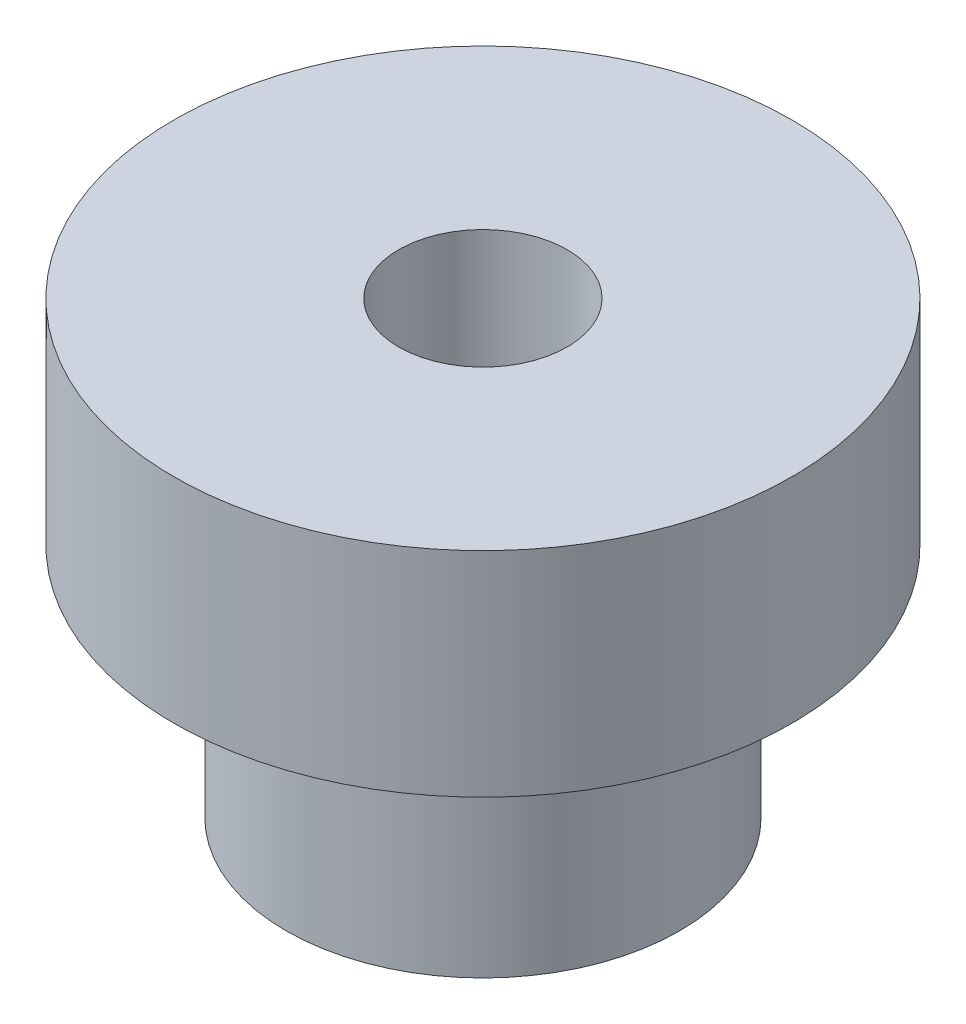
ISO-10303-21;
HEADER;
FILE_DESCRIPTION(('STEP AP214'),'2;1');
FILE_NAME('part.step','',(''),(''),'','','');
FILE_SCHEMA(('AUTOMOTIVE_DESIGN { 1 0 10303 214 1 1 1 1 }'));
ENDSEC;
DATA;
#1=APPLICATION_CONTEXT('core data for automotive mechanical design processes');
#2=APPLICATION_PROTOCOL_DEFINITION('international standard','automotive_design',2000,#1);
#3=PRODUCT_CONTEXT('',#1,'mechanical');
#4=PRODUCT('Part','Part','',(#3));
#5=PRODUCT_RELATED_PRODUCT_CATEGORY('part','',(#4));
#6=PRODUCT_DEFINITION_FORMATION('','',#4);
#7=PRODUCT_DEFINITION_CONTEXT('part definition',#1,'design');
#8=PRODUCT_DEFINITION('design','',#6,#7);
#9=PRODUCT_DEFINITION_SHAPE('','',#8);
#10=(LENGTH_UNIT() NAMED_UNIT(*) SI_UNIT(.MILLI.,.METRE.));
#11=(NAMED_UNIT(*) PLANE_ANGLE_UNIT() SI_UNIT($,.RADIAN.));
#12=(NAMED_UNIT(*) SI_UNIT($,.STERADIAN.) SOLID_ANGLE_UNIT());
#13=UNCERTAINTY_MEASURE_WITH_UNIT(LENGTH_MEASURE(1.E-05),#10,'distance_accuracy_value','');
#14=(GEOMETRIC_REPRESENTATION_CONTEXT(3) GLOBAL_UNCERTAINTY_ASSIGNED_CONTEXT((#13)) GLOBAL_UNIT_ASSIGNED_CONTEXT((#10,
#11,#12)) REPRESENTATION_CONTEXT('',''));
#15=CARTESIAN_POINT('',(0.,0.,0.));
#16=DIRECTION('',(0.,0.,1.));
#17=DIRECTION('',(1.,0.,0.));
#18=AXIS2_PLACEMENT_3D('',#15,#16,#17);
#19=CARTESIAN_POINT('',(0.,0.,0.));
#20=DIRECTION('',(0.,1.,0.));
#21=DIRECTION('',(0.,0.,1.));
#22=AXIS2_PLACEMENT_3D('',#19,#20,#21);
#23=PLANE('',#22);
#24=CARTESIAN_POINT('',(0.,0.,0.));
#25=DIRECTION('',(0.,1.,0.));
#26=DIRECTION('',(0.,0.,1.));
#27=AXIS2_PLACEMENT_3D('',#24,#25,#26);
#28=CIRCLE('',#27,5.5);
#29=CARTESIAN_POINT('',(0.,0.,-5.5));
#30=VERTEX_POINT('',#29);
#31=EDGE_CURVE('E42',#30,#30,#28,.T.);
#32=ORIENTED_EDGE('',*,*,#31,.F.);
#33=EDGE_LOOP('',(#32));
#34=FACE_BOUND('',#33,.T.);
#35=CARTESIAN_POINT('',(0.,0.,0.));
#36=DIRECTION('',(0.,1.,0.));
#37=DIRECTION('',(0.,0.,1.));
#38=AXIS2_PLACEMENT_3D('',#35,#36,#37);
#39=CIRCLE('',#38,3.5);
#40=CARTESIAN_POINT('',(0.,0.,3.5));
#41=VERTEX_POINT('',#40);
#42=EDGE_CURVE('E10',#41,#41,#39,.F.);
#43=ORIENTED_EDGE('',*,*,#42,.F.);
#44=EDGE_LOOP('',(#43));
#45=FACE_BOUND('',#44,.T.);
#46=ADVANCED_FACE('F31',(#34,#45),#23,.F.);
#47=CARTESIAN_POINT('',(0.,3.8,0.));
#48=DIRECTION('',(0.,-1.,0.));
#49=DIRECTION('',(0.,0.,-1.));
#50=AXIS2_PLACEMENT_3D('',#47,#48,#49);
#51=CYLINDRICAL_SURFACE('',#50,5.5);
#52=CARTESIAN_POINT('',(0.,3.8,0.));
#53=DIRECTION('',(0.,1.,0.));
#54=DIRECTION('',(0.,0.,1.));
#55=AXIS2_PLACEMENT_3D('',#52,#53,#54);
#56=CIRCLE('',#55,5.5);
#57=CARTESIAN_POINT('',(0.,3.8,-5.5));
#58=VERTEX_POINT('',#57);
#59=EDGE_CURVE('E38',#58,#58,#56,.T.);
#60=CARTESIAN_POINT('',(0.,3.8,-5.5));
#61=CARTESIAN_POINT('',(0.,3.76041666666667,-5.5));
#62=CARTESIAN_POINT('',(0.,3.72083333333333,-5.5));
#63=CARTESIAN_POINT('',(0.,3.64166666666667,-5.5));
#64=CARTESIAN_POINT('',(0.,3.60208333333333,-5.5));
#65=CARTESIAN_POINT('',(0.,3.52291666666667,-5.5));
#66=CARTESIAN_POINT('',(0.,3.48333333333333,-5.5));
#67=CARTESIAN_POINT('',(0.,3.40416666666667,-5.5));
#68=CARTESIAN_POINT('',(0.,3.36458333333333,-5.5));
#69=CARTESIAN_POINT('',(0.,3.28541666666667,-5.5));
#70=CARTESIAN_POINT('',(0.,3.24583333333333,-5.5));
#71=CARTESIAN_POINT('',(0.,3.16666666666667,-5.5));
#72=CARTESIAN_POINT('',(0.,3.12708333333333,-5.5));
#73=CARTESIAN_POINT('',(0.,3.04791666666667,-5.5));
#74=CARTESIAN_POINT('',(0.,3.00833333333333,-5.5));
#75=CARTESIAN_POINT('',(0.,2.92916666666667,-5.5));
#76=CARTESIAN_POINT('',(0.,2.88958333333333,-5.5));
#77=CARTESIAN_POINT('',(0.,2.81041666666667,-5.5));
#78=CARTESIAN_POINT('',(0.,2.77083333333333,-5.5));
#79=CARTESIAN_POINT('',(0.,2.69166666666667,-5.5));
#80=CARTESIAN_POINT('',(0.,2.65208333333333,-5.5));
#81=CARTESIAN_POINT('',(0.,2.57291666666667,-5.5));
#82=CARTESIAN_POINT('',(0.,2.53333333333333,-5.5));
#83=CARTESIAN_POINT('',(0.,2.45416666666667,-5.5));
#84=CARTESIAN_POINT('',(0.,2.41458333333333,-5.5));
#85=CARTESIAN_POINT('',(0.,2.33541666666667,-5.5));
#86=CARTESIAN_POINT('',(0.,2.29583333333333,-5.5));
#87=CARTESIAN_POINT('',(0.,2.21666666666667,-5.5));
#88=CARTESIAN_POINT('',(0.,2.17708333333333,-5.5));
#89=CARTESIAN_POINT('',(0.,2.09791666666667,-5.5));
#90=CARTESIAN_POINT('',(0.,2.05833333333333,-5.5));
#91=CARTESIAN_POINT('',(0.,1.97916666666667,-5.5));
#92=CARTESIAN_POINT('',(0.,1.93958333333333,-5.5));
#93=CARTESIAN_POINT('',(0.,1.86041666666667,-5.5));
#94=CARTESIAN_POINT('',(0.,1.82083333333333,-5.5));
#95=CARTESIAN_POINT('',(0.,1.74166666666667,-5.5));
#96=CARTESIAN_POINT('',(0.,1.70208333333333,-5.5));
#97=CARTESIAN_POINT('',(0.,1.62291666666667,-5.5));
#98=CARTESIAN_POINT('',(0.,1.58333333333333,-5.5));
#99=CARTESIAN_POINT('',(0.,1.50416666666667,-5.5));
#100=CARTESIAN_POINT('',(0.,1.46458333333333,-5.5));
#101=CARTESIAN_POINT('',(0.,1.38541666666667,-5.5));
#102=CARTESIAN_POINT('',(0.,1.34583333333333,-5.5));
#103=CARTESIAN_POINT('',(0.,1.26666666666667,-5.5));
#104=CARTESIAN_POINT('',(0.,1.22708333333333,-5.5));
#105=CARTESIAN_POINT('',(0.,1.14791666666667,-5.5));
#106=CARTESIAN_POINT('',(0.,1.10833333333333,-5.5));
#107=CARTESIAN_POINT('',(0.,1.02916666666667,-5.5));
#108=CARTESIAN_POINT('',(0.,0.989583333333333,-5.5));
#109=CARTESIAN_POINT('',(0.,0.910416666666667,-5.5));
#110=CARTESIAN_POINT('',(0.,0.870833333333333,-5.5));
#111=CARTESIAN_POINT('',(0.,0.791666666666667,-5.5));
#112=CARTESIAN_POINT('',(0.,0.752083333333333,-5.5));
#113=CARTESIAN_POINT('',(0.,0.672916666666667,-5.5));
#114=CARTESIAN_POINT('',(0.,0.633333333333333,-5.5));
#115=CARTESIAN_POINT('',(0.,0.554166666666667,-5.5));
#116=CARTESIAN_POINT('',(0.,0.514583333333334,-5.5));
#117=CARTESIAN_POINT('',(0.,0.435416666666667,-5.5));
#118=CARTESIAN_POINT('',(0.,0.395833333333333,-5.5));
#119=CARTESIAN_POINT('',(0.,0.316666666666666,-5.5));
#120=CARTESIAN_POINT('',(0.,0.277083333333333,-5.5));
#121=CARTESIAN_POINT('',(0.,0.197916666666667,-5.5));
#122=CARTESIAN_POINT('',(0.,0.158333333333333,-5.5));
#123=CARTESIAN_POINT('',(0.,0.0791666666666666,-5.5));
#124=CARTESIAN_POINT('',(0.,0.0395833333333333,-5.5));
#125=CARTESIAN_POINT('',(0.,0.,-5.5));
#126=B_SPLINE_CURVE_WITH_KNOTS('',3,(#60,#61,#62,#63,#64,#65,#66,#67,#68,#69,#70,#71,#72,#73,
#74,#75,#76,#77,#78,#79,#80,#81,#82,#83,#84,#85,#86,#87,#88,#89,#90,#91,#92,#93,#94,#95,#96,#97,
#98,#99,#100,#101,#102,#103,#104,#105,#106,#107,#108,#109,#110,#111,#112,#113,#114,#115,#116,
#117,#118,#119,#120,#121,#122,#123,#124,#125),.UNSPECIFIED.,.F.,.F.,(4,2,2,2,2,2,2,2,2,2,2,2,2,
2,2,2,2,2,2,2,2,2,2,2,2,2,2,2,2,2,2,2,4),(0.,0.11875,0.2375,0.35625,0.475,0.59375,0.7125,
0.831249999999999,0.95,1.06875,1.1875,1.30625,1.425,1.54375,1.6625,1.78125,1.9,2.01875,2.1375,
2.25625,2.375,2.49375,2.6125,2.73125,2.85,2.96875,3.0875,3.20625,3.325,3.44375,3.5625,3.68125,
3.8),.UNSPECIFIED.);
#127=EDGE_CURVE('BSEAM33',#58,#30,#126,.T.);
#128=ORIENTED_EDGE('',*,*,#59,.F.);
#129=ORIENTED_EDGE('',*,*,#31,.T.);
#130=ORIENTED_EDGE('',*,*,#127,.T.);
#131=ORIENTED_EDGE('',*,*,#127,.F.);
#132=EDGE_LOOP('',(#128,#130,#129,#131));
#133=FACE_BOUND('',#132,.T.);
#134=ADVANCED_FACE('F33',(#133),#51,.T.);
#135=CARTESIAN_POINT('',(0.,3.8,0.));
#136=DIRECTION('',(0.,1.,0.));
#137=DIRECTION('',(0.,0.,1.));
#138=AXIS2_PLACEMENT_3D('',#135,#136,#137);
#139=PLANE('',#138);
#140=CARTESIAN_POINT('',(0.,3.8,0.));
#141=DIRECTION('',(0.,1.,0.));
#142=DIRECTION('',(0.,0.,1.));
#143=AXIS2_PLACEMENT_3D('',#140,#141,#142);
#144=CIRCLE('',#143,1.5);
#145=CARTESIAN_POINT('',(0.,3.8,1.5));
#146=VERTEX_POINT('',#145);
#147=EDGE_CURVE('E52',#146,#146,#144,.T.);
#148=ORIENTED_EDGE('',*,*,#147,.F.);
#149=EDGE_LOOP('',(#148));
#150=FACE_BOUND('',#149,.T.);
#151=ORIENTED_EDGE('',*,*,#59,.T.);
#152=EDGE_LOOP('',(#151));
#153=FACE_BOUND('',#152,.T.);
#154=ADVANCED_FACE('F67',(#150,#153),#139,.T.);
#155=CARTESIAN_POINT('',(0.,-4.2,0.));
#156=DIRECTION('',(0.,1.,0.));
#157=DIRECTION('',(0.,0.,1.));
#158=AXIS2_PLACEMENT_3D('',#155,#156,#157);
#159=CYLINDRICAL_SURFACE('',#158,3.5);
#160=CARTESIAN_POINT('',(0.,-4.2,0.));
#161=DIRECTION('',(0.,-1.,0.));
#162=DIRECTION('',(0.,0.,-1.));
#163=AXIS2_PLACEMENT_3D('',#160,#161,#162);
#164=CIRCLE('',#163,3.5);
#165=CARTESIAN_POINT('',(0.,-4.2,-3.5));
#166=VERTEX_POINT('',#165);
#167=EDGE_CURVE('E47',#166,#166,#164,.T.);
#168=ORIENTED_EDGE('',*,*,#167,.F.);
#169=EDGE_LOOP('',(#168));
#170=FACE_BOUND('',#169,.T.);
#171=ORIENTED_EDGE('',*,*,#42,.T.);
#172=EDGE_LOOP('',(#171));
#173=FACE_BOUND('',#172,.T.);
#174=ADVANCED_FACE('F69',(#170,#173),#159,.T.);
#175=CARTESIAN_POINT('',(0.,-4.2,0.));
#176=DIRECTION('',(0.,-1.,0.));
#177=DIRECTION('',(0.,0.,-1.));
#178=AXIS2_PLACEMENT_3D('',#175,#176,#177);
#179=PLANE('',#178);
#180=CARTESIAN_POINT('',(0.,-4.2,0.));
#181=DIRECTION('',(0.,1.,0.));
#182=DIRECTION('',(0.,0.,1.));
#183=AXIS2_PLACEMENT_3D('',#180,#181,#182);
#184=CIRCLE('',#183,1.5);
#185=CARTESIAN_POINT('',(0.,-4.2,1.5));
#186=VERTEX_POINT('',#185);
#187=EDGE_CURVE('E51',#186,#186,#184,.T.);
#188=ORIENTED_EDGE('',*,*,#187,.T.);
#189=EDGE_LOOP('',(#188));
#190=FACE_BOUND('',#189,.T.);
#191=ORIENTED_EDGE('',*,*,#167,.T.);
#192=EDGE_LOOP('',(#191));
#193=FACE_BOUND('',#192,.T.);
#194=ADVANCED_FACE('F58',(#190,#193),#179,.T.);
#195=CARTESIAN_POINT('',(0.,-4.2,0.));
#196=DIRECTION('',(0.,1.,0.));
#197=DIRECTION('',(0.,0.,1.));
#198=AXIS2_PLACEMENT_3D('',#195,#196,#197);
#199=CYLINDRICAL_SURFACE('',#198,1.5);
#200=ORIENTED_EDGE('',*,*,#187,.F.);
#201=EDGE_LOOP('',(#200));
#202=FACE_BOUND('',#201,.T.);
#203=ORIENTED_EDGE('',*,*,#147,.T.);
#204=EDGE_LOOP('',(#203));
#205=FACE_BOUND('',#204,.T.);
#206=ADVANCED_FACE('F61',(#202,#205),#199,.F.);
#207=CLOSED_SHELL('',(#46,#134,#154,#174,#194,#206));
#208=MANIFOLD_SOLID_BREP('B2',#207);
#209=ADVANCED_BREP_SHAPE_REPRESENTATION('',(#18,#208),#14);
#210=SHAPE_DEFINITION_REPRESENTATION(#9,#209);
ENDSEC;
END-ISO-10303-21;
